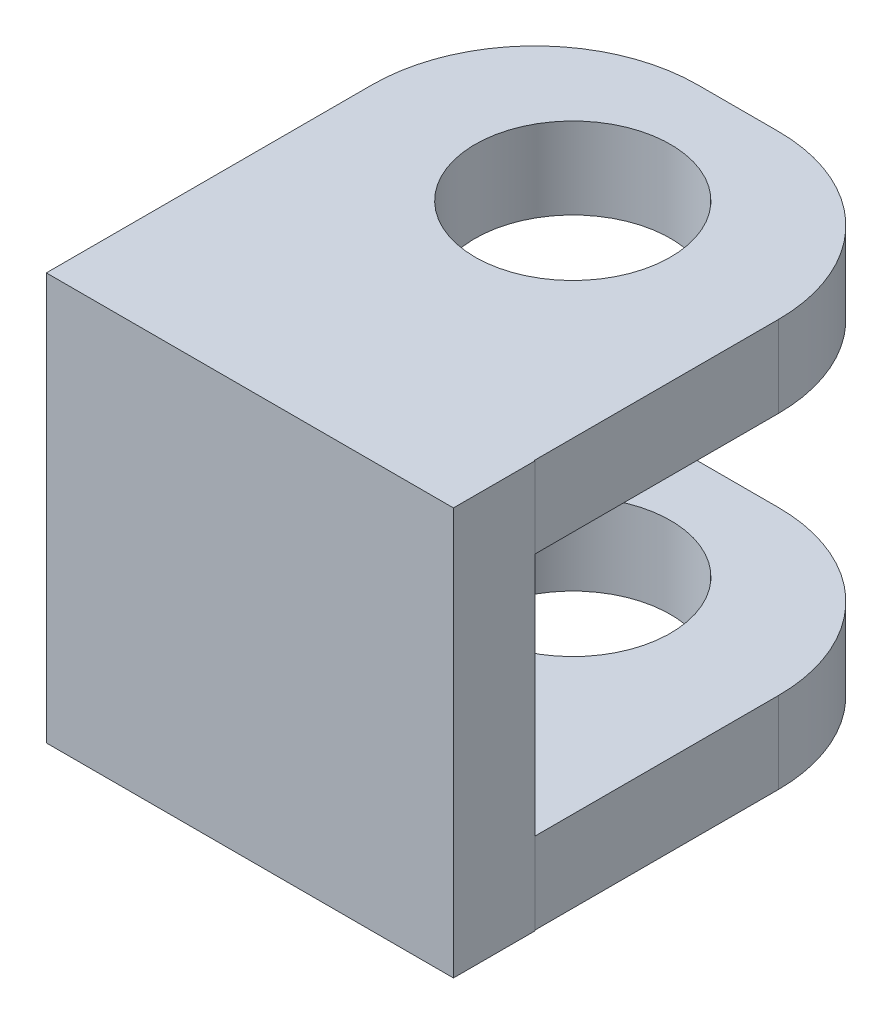
ISO-10303-21;
HEADER;
FILE_DESCRIPTION(('STEP AP214'),'2;1');
FILE_NAME('part.step','',(''),(''),'','','');
FILE_SCHEMA(('AUTOMOTIVE_DESIGN { 1 0 10303 214 1 1 1 1 }'));
ENDSEC;
DATA;
#1=APPLICATION_CONTEXT('core data for automotive mechanical design processes');
#2=APPLICATION_PROTOCOL_DEFINITION('international standard','automotive_design',2000,#1);
#3=PRODUCT_CONTEXT('',#1,'mechanical');
#4=PRODUCT('Part','Part','',(#3));
#5=PRODUCT_RELATED_PRODUCT_CATEGORY('part','',(#4));
#6=PRODUCT_DEFINITION_FORMATION('','',#4);
#7=PRODUCT_DEFINITION_CONTEXT('part definition',#1,'design');
#8=PRODUCT_DEFINITION('design','',#6,#7);
#9=PRODUCT_DEFINITION_SHAPE('','',#8);
#10=(LENGTH_UNIT() NAMED_UNIT(*) SI_UNIT(.MILLI.,.METRE.));
#11=(NAMED_UNIT(*) PLANE_ANGLE_UNIT() SI_UNIT($,.RADIAN.));
#12=(NAMED_UNIT(*) SI_UNIT($,.STERADIAN.) SOLID_ANGLE_UNIT());
#13=UNCERTAINTY_MEASURE_WITH_UNIT(LENGTH_MEASURE(1.E-05),#10,'distance_accuracy_value','');
#14=(GEOMETRIC_REPRESENTATION_CONTEXT(3) GLOBAL_UNCERTAINTY_ASSIGNED_CONTEXT((#13)) GLOBAL_UNIT_ASSIGNED_CONTEXT((#10,
#11,#12)) REPRESENTATION_CONTEXT('',''));
#15=CARTESIAN_POINT('',(0.,0.,0.));
#16=DIRECTION('',(0.,0.,1.));
#17=DIRECTION('',(1.,0.,0.));
#18=AXIS2_PLACEMENT_3D('',#15,#16,#17);
#19=CARTESIAN_POINT('',(0.,0.,10.));
#20=DIRECTION('',(1.,0.,0.));
#21=DIRECTION('',(0.,0.,-1.));
#22=AXIS2_PLACEMENT_3D('',#19,#20,#21);
#23=PLANE('',#22);
#24=DIRECTION('',(0.,0.,-1.));
#25=VECTOR('',#24,1.);
#26=CARTESIAN_POINT('',(0.,50.,10.));
#27=LINE('',#26,#25);
#28=CARTESIAN_POINT('',(0.,50.,10.));
#29=VERTEX_POINT('',#28);
#30=CARTESIAN_POINT('',(0.,50.,-29.9999999999999));
#31=VERTEX_POINT('',#30);
#32=EDGE_CURVE('E173',#29,#31,#27,.T.);
#33=ORIENTED_EDGE('',*,*,#32,.T.);
#34=DIRECTION('',(0.,1.,0.));
#35=VECTOR('',#34,1.);
#36=CARTESIAN_POINT('',(0.,40.,-29.9999999999999));
#37=LINE('',#36,#35);
#38=CARTESIAN_POINT('',(0.,40.,-29.9999999999999));
#39=VERTEX_POINT('',#38);
#40=EDGE_CURVE('E151',#39,#31,#37,.T.);
#41=ORIENTED_EDGE('',*,*,#40,.F.);
#42=DIRECTION('',(0.,0.,1.));
#43=VECTOR('',#42,1.);
#44=CARTESIAN_POINT('',(0.,40.,0.));
#45=LINE('',#44,#43);
#46=CARTESIAN_POINT('',(0.,40.,0.));
#47=VERTEX_POINT('',#46);
#48=EDGE_CURVE('E143',#39,#47,#45,.T.);
#49=ORIENTED_EDGE('',*,*,#48,.T.);
#50=DIRECTION('',(0.,-1.,0.));
#51=VECTOR('',#50,1.);
#52=CARTESIAN_POINT('',(0.,0.,0.));
#53=LINE('',#52,#51);
#54=CARTESIAN_POINT('',(0.,10.,0.));
#55=VERTEX_POINT('',#54);
#56=EDGE_CURVE('E60',#47,#55,#53,.T.);
#57=ORIENTED_EDGE('',*,*,#56,.T.);
#58=DIRECTION('',(0.,0.,1.));
#59=VECTOR('',#58,1.);
#60=CARTESIAN_POINT('',(0.,10.,0.));
#61=LINE('',#60,#59);
#62=CARTESIAN_POINT('',(0.,10.,-29.9999999999999));
#63=VERTEX_POINT('',#62);
#64=EDGE_CURVE('E218',#63,#55,#61,.T.);
#65=ORIENTED_EDGE('',*,*,#64,.F.);
#66=DIRECTION('',(0.,-1.,0.));
#67=VECTOR('',#66,1.);
#68=CARTESIAN_POINT('',(0.,10.,-29.9999999999999));
#69=LINE('',#68,#67);
#70=CARTESIAN_POINT('',(0.,0.,-29.9999999999999));
#71=VERTEX_POINT('',#70);
#72=EDGE_CURVE('E211',#63,#71,#69,.T.);
#73=ORIENTED_EDGE('',*,*,#72,.T.);
#74=DIRECTION('',(0.,0.,-1.));
#75=VECTOR('',#74,1.);
#76=CARTESIAN_POINT('',(0.,0.,10.));
#77=LINE('',#76,#75);
#78=CARTESIAN_POINT('',(0.,0.,10.));
#79=VERTEX_POINT('',#78);
#80=EDGE_CURVE('E11',#79,#71,#77,.T.);
#81=ORIENTED_EDGE('',*,*,#80,.F.);
#82=DIRECTION('',(0.,-1.,0.));
#83=VECTOR('',#82,1.);
#84=CARTESIAN_POINT('',(0.,0.,10.));
#85=LINE('',#84,#83);
#86=EDGE_CURVE('E172',#29,#79,#85,.T.);
#87=ORIENTED_EDGE('',*,*,#86,.F.);
#88=EDGE_LOOP('',(#33,#41,#49,#57,#65,#73,#81,#87));
#89=FACE_BOUND('',#88,.T.);
#90=ADVANCED_FACE('F37',(#89),#23,.F.);
#91=CARTESIAN_POINT('',(0.,0.,10.));
#92=DIRECTION('',(0.,1.,0.));
#93=DIRECTION('',(0.,0.,1.));
#94=AXIS2_PLACEMENT_3D('',#91,#92,#93);
#95=PLANE('',#94);
#96=CARTESIAN_POINT('',(24.6590423705941,0.,-29.9999999999999));
#97=DIRECTION('',(0.,1.,0.));
#98=DIRECTION('',(0.,0.,1.));
#99=AXIS2_PLACEMENT_3D('',#96,#97,#98);
#100=CIRCLE('',#99,12.);
#101=CARTESIAN_POINT('',(24.6590423705941,0.,-17.9999999999999));
#102=VERTEX_POINT('',#101);
#103=EDGE_CURVE('E250',#102,#102,#100,.T.);
#104=ORIENTED_EDGE('',*,*,#103,.T.);
#105=EDGE_LOOP('',(#104));
#106=FACE_BOUND('',#105,.T.);
#107=ORIENTED_EDGE('',*,*,#80,.T.);
#108=CARTESIAN_POINT('',(20.,0.,-30.));
#109=DIRECTION('',(0.,1.,0.));
#110=DIRECTION('',(0.,0.,1.));
#111=AXIS2_PLACEMENT_3D('',#108,#109,#110);
#112=CIRCLE('',#111,20.);
#113=CARTESIAN_POINT('',(20.0000000000001,0.,-50.));
#114=VERTEX_POINT('',#113);
#115=EDGE_CURVE('E215',#114,#71,#112,.T.);
#116=ORIENTED_EDGE('',*,*,#115,.F.);
#117=DIRECTION('',(-1.,0.,0.));
#118=VECTOR('',#117,1.);
#119=CARTESIAN_POINT('',(20.0000000000001,0.,-50.));
#120=LINE('',#119,#118);
#121=CARTESIAN_POINT('',(29.9110021678277,0.,-50.));
#122=VERTEX_POINT('',#121);
#123=EDGE_CURVE('E219',#122,#114,#120,.T.);
#124=ORIENTED_EDGE('',*,*,#123,.F.);
#125=CARTESIAN_POINT('',(29.9110021678279,0.,-30.));
#126=DIRECTION('',(0.,1.,0.));
#127=DIRECTION('',(0.,0.,-1.));
#128=AXIS2_PLACEMENT_3D('',#125,#126,#127);
#129=CIRCLE('',#128,20.);
#130=CARTESIAN_POINT('',(49.9110021678279,0.,-29.9999999999999));
#131=VERTEX_POINT('',#130);
#132=EDGE_CURVE('E221',#131,#122,#129,.T.);
#133=ORIENTED_EDGE('',*,*,#132,.F.);
#134=DIRECTION('',(0.,0.,-1.));
#135=VECTOR('',#134,1.);
#136=CARTESIAN_POINT('',(49.9110021678279,0.,0.));
#137=LINE('',#136,#135);
#138=CARTESIAN_POINT('',(49.9110021678279,0.,0.));
#139=VERTEX_POINT('',#138);
#140=EDGE_CURVE('E223',#139,#131,#137,.T.);
#141=ORIENTED_EDGE('',*,*,#140,.F.);
#142=DIRECTION('',(1.,0.,0.));
#143=VECTOR('',#142,1.);
#144=CARTESIAN_POINT('',(0.,0.,0.));
#145=LINE('',#144,#143);
#146=CARTESIAN_POINT('',(50.,0.,0.));
#147=VERTEX_POINT('',#146);
#148=EDGE_CURVE('E52',#139,#147,#145,.T.);
#149=ORIENTED_EDGE('',*,*,#148,.T.);
#150=DIRECTION('',(0.,0.,-1.));
#151=VECTOR('',#150,1.);
#152=CARTESIAN_POINT('',(50.,0.,10.));
#153=LINE('',#152,#151);
#154=CARTESIAN_POINT('',(50.,0.,10.));
#155=VERTEX_POINT('',#154);
#156=EDGE_CURVE('E45',#155,#147,#153,.T.);
#157=ORIENTED_EDGE('',*,*,#156,.F.);
#158=DIRECTION('',(1.,0.,0.));
#159=VECTOR('',#158,1.);
#160=CARTESIAN_POINT('',(0.,0.,10.));
#161=LINE('',#160,#159);
#162=EDGE_CURVE('E199',#79,#155,#161,.T.);
#163=ORIENTED_EDGE('',*,*,#162,.F.);
#164=EDGE_LOOP('',(#107,#116,#124,#133,#141,#149,#157,#163));
#165=FACE_BOUND('',#164,.T.);
#166=ADVANCED_FACE('F284',(#106,#165),#95,.F.);
#167=CARTESIAN_POINT('',(50.,0.,10.));
#168=DIRECTION('',(-1.,0.,0.));
#169=DIRECTION('',(0.,-1.,0.));
#170=AXIS2_PLACEMENT_3D('',#167,#168,#169);
#171=PLANE('',#170);
#172=DIRECTION('',(0.,1.,0.));
#173=VECTOR('',#172,1.);
#174=CARTESIAN_POINT('',(50.,0.,0.));
#175=LINE('',#174,#173);
#176=CARTESIAN_POINT('',(50.,50.,0.));
#177=VERTEX_POINT('',#176);
#178=EDGE_CURVE('E160',#147,#177,#175,.T.);
#179=ORIENTED_EDGE('',*,*,#178,.T.);
#180=DIRECTION('',(0.,0.,-1.));
#181=VECTOR('',#180,1.);
#182=CARTESIAN_POINT('',(50.,50.,10.));
#183=LINE('',#182,#181);
#184=CARTESIAN_POINT('',(50.,50.,10.));
#185=VERTEX_POINT('',#184);
#186=EDGE_CURVE('E175',#185,#177,#183,.T.);
#187=ORIENTED_EDGE('',*,*,#186,.F.);
#188=DIRECTION('',(0.,1.,0.));
#189=VECTOR('',#188,1.);
#190=CARTESIAN_POINT('',(50.,0.,10.));
#191=LINE('',#190,#189);
#192=EDGE_CURVE('E184',#155,#185,#191,.T.);
#193=ORIENTED_EDGE('',*,*,#192,.F.);
#194=ORIENTED_EDGE('',*,*,#156,.T.);
#195=EDGE_LOOP('',(#179,#187,#193,#194));
#196=FACE_BOUND('',#195,.T.);
#197=ADVANCED_FACE('F182',(#196),#171,.F.);
#198=CARTESIAN_POINT('',(0.,50.,10.));
#199=DIRECTION('',(0.,-1.,0.));
#200=DIRECTION('',(0.,0.,-1.));
#201=AXIS2_PLACEMENT_3D('',#198,#199,#200);
#202=PLANE('',#201);
#203=CARTESIAN_POINT('',(24.6590423705941,50.,-29.9999999999999));
#204=DIRECTION('',(0.,1.,0.));
#205=DIRECTION('',(0.,0.,1.));
#206=AXIS2_PLACEMENT_3D('',#203,#204,#205);
#207=CIRCLE('',#206,12.);
#208=CARTESIAN_POINT('',(24.6590423705941,50.,-17.9999999999999));
#209=VERTEX_POINT('',#208);
#210=EDGE_CURVE('E264',#209,#209,#207,.T.);
#211=ORIENTED_EDGE('',*,*,#210,.F.);
#212=EDGE_LOOP('',(#211));
#213=FACE_BOUND('',#212,.T.);
#214=DIRECTION('',(-1.,0.,0.));
#215=VECTOR('',#214,1.);
#216=CARTESIAN_POINT('',(0.,50.,0.));
#217=LINE('',#216,#215);
#218=CARTESIAN_POINT('',(49.9110021678279,50.,0.));
#219=VERTEX_POINT('',#218);
#220=EDGE_CURVE('E169',#177,#219,#217,.T.);
#221=ORIENTED_EDGE('',*,*,#220,.T.);
#222=DIRECTION('',(0.,0.,-1.));
#223=VECTOR('',#222,1.);
#224=CARTESIAN_POINT('',(49.9110021678279,50.,0.));
#225=LINE('',#224,#223);
#226=CARTESIAN_POINT('',(49.9110021678279,50.,-29.9999999999999));
#227=VERTEX_POINT('',#226);
#228=EDGE_CURVE('E192',#219,#227,#225,.T.);
#229=ORIENTED_EDGE('',*,*,#228,.T.);
#230=CARTESIAN_POINT('',(29.9110021678279,50.,-30.));
#231=DIRECTION('',(0.,1.,0.));
#232=DIRECTION('',(0.,0.,1.));
#233=AXIS2_PLACEMENT_3D('',#230,#231,#232);
#234=CIRCLE('',#233,20.);
#235=CARTESIAN_POINT('',(29.9110021678277,50.,-50.));
#236=VERTEX_POINT('',#235);
#237=EDGE_CURVE('E247',#227,#236,#234,.T.);
#238=ORIENTED_EDGE('',*,*,#237,.T.);
#239=DIRECTION('',(-1.,0.,0.));
#240=VECTOR('',#239,1.);
#241=CARTESIAN_POINT('',(20.0000000000001,50.,-50.));
#242=LINE('',#241,#240);
#243=CARTESIAN_POINT('',(20.0000000000001,50.,-50.));
#244=VERTEX_POINT('',#243);
#245=EDGE_CURVE('E244',#236,#244,#242,.T.);
#246=ORIENTED_EDGE('',*,*,#245,.T.);
#247=CARTESIAN_POINT('',(20.,50.,-30.));
#248=DIRECTION('',(0.,1.,0.));
#249=DIRECTION('',(0.,0.,1.));
#250=AXIS2_PLACEMENT_3D('',#247,#248,#249);
#251=CIRCLE('',#250,20.);
#252=EDGE_CURVE('E152',#244,#31,#251,.T.);
#253=ORIENTED_EDGE('',*,*,#252,.T.);
#254=ORIENTED_EDGE('',*,*,#32,.F.);
#255=DIRECTION('',(-1.,0.,0.));
#256=VECTOR('',#255,1.);
#257=CARTESIAN_POINT('',(0.,50.,10.));
#258=LINE('',#257,#256);
#259=EDGE_CURVE('E165',#185,#29,#258,.T.);
#260=ORIENTED_EDGE('',*,*,#259,.F.);
#261=ORIENTED_EDGE('',*,*,#186,.T.);
#262=EDGE_LOOP('',(#221,#229,#238,#246,#253,#254,#260,#261));
#263=FACE_BOUND('',#262,.T.);
#264=ADVANCED_FACE('F190',(#213,#263),#202,.F.);
#265=CARTESIAN_POINT('',(0.,0.,10.));
#266=DIRECTION('',(0.,0.,-1.));
#267=DIRECTION('',(-1.,0.,0.));
#268=AXIS2_PLACEMENT_3D('',#265,#266,#267);
#269=PLANE('',#268);
#270=ORIENTED_EDGE('',*,*,#86,.T.);
#271=ORIENTED_EDGE('',*,*,#162,.T.);
#272=ORIENTED_EDGE('',*,*,#192,.T.);
#273=ORIENTED_EDGE('',*,*,#259,.T.);
#274=EDGE_LOOP('',(#270,#271,#272,#273));
#275=FACE_BOUND('',#274,.T.);
#276=ADVANCED_FACE('F296',(#275),#269,.F.);
#277=CARTESIAN_POINT('',(0.,0.,0.));
#278=DIRECTION('',(0.,0.,-1.));
#279=DIRECTION('',(-1.,0.,0.));
#280=AXIS2_PLACEMENT_3D('',#277,#278,#279);
#281=PLANE('',#280);
#282=DIRECTION('',(0.,1.,0.));
#283=VECTOR('',#282,1.);
#284=CARTESIAN_POINT('',(49.9110021678279,40.,0.));
#285=LINE('',#284,#283);
#286=CARTESIAN_POINT('',(49.9110021678279,40.,0.));
#287=VERTEX_POINT('',#286);
#288=EDGE_CURVE('E187',#287,#219,#285,.T.);
#289=ORIENTED_EDGE('',*,*,#288,.T.);
#290=ORIENTED_EDGE('',*,*,#220,.F.);
#291=ORIENTED_EDGE('',*,*,#178,.F.);
#292=ORIENTED_EDGE('',*,*,#148,.F.);
#293=DIRECTION('',(0.,-1.,0.));
#294=VECTOR('',#293,1.);
#295=CARTESIAN_POINT('',(49.9110021678279,10.,0.));
#296=LINE('',#295,#294);
#297=CARTESIAN_POINT('',(49.9110021678279,10.,0.));
#298=VERTEX_POINT('',#297);
#299=EDGE_CURVE('E158',#298,#139,#296,.T.);
#300=ORIENTED_EDGE('',*,*,#299,.F.);
#301=DIRECTION('',(1.,0.,0.));
#302=VECTOR('',#301,1.);
#303=CARTESIAN_POINT('',(0.,10.,0.));
#304=LINE('',#303,#302);
#305=EDGE_CURVE('E156',#55,#298,#304,.T.);
#306=ORIENTED_EDGE('',*,*,#305,.F.);
#307=ORIENTED_EDGE('',*,*,#56,.F.);
#308=DIRECTION('',(1.,0.,0.));
#309=VECTOR('',#308,1.);
#310=CARTESIAN_POINT('',(0.,40.,0.));
#311=LINE('',#310,#309);
#312=EDGE_CURVE('E140',#47,#287,#311,.T.);
#313=ORIENTED_EDGE('',*,*,#312,.T.);
#314=EDGE_LOOP('',(#289,#290,#291,#292,#300,#306,#307,#313));
#315=FACE_BOUND('',#314,.T.);
#316=ADVANCED_FACE('F154',(#315),#281,.T.);
#317=CARTESIAN_POINT('',(49.9110021678279,10.,0.));
#318=DIRECTION('',(-1.,0.,0.));
#319=DIRECTION('',(0.,0.,1.));
#320=AXIS2_PLACEMENT_3D('',#317,#318,#319);
#321=PLANE('',#320);
#322=ORIENTED_EDGE('',*,*,#140,.T.);
#323=DIRECTION('',(0.,-1.,0.));
#324=VECTOR('',#323,1.);
#325=CARTESIAN_POINT('',(49.9110021678279,10.,-29.9999999999999));
#326=LINE('',#325,#324);
#327=CARTESIAN_POINT('',(49.9110021678279,10.,-29.9999999999999));
#328=VERTEX_POINT('',#327);
#329=EDGE_CURVE('E162',#328,#131,#326,.T.);
#330=ORIENTED_EDGE('',*,*,#329,.F.);
#331=DIRECTION('',(0.,0.,-1.));
#332=VECTOR('',#331,1.);
#333=CARTESIAN_POINT('',(49.9110021678279,10.,0.));
#334=LINE('',#333,#332);
#335=EDGE_CURVE('E230',#298,#328,#334,.T.);
#336=ORIENTED_EDGE('',*,*,#335,.F.);
#337=ORIENTED_EDGE('',*,*,#299,.T.);
#338=EDGE_LOOP('',(#322,#330,#336,#337));
#339=FACE_BOUND('',#338,.T.);
#340=ADVANCED_FACE('F300',(#339),#321,.F.);
#341=CARTESIAN_POINT('',(29.9110021678279,10.,-30.));
#342=DIRECTION('',(0.,-1.,0.));
#343=DIRECTION('',(0.,0.,-1.));
#344=AXIS2_PLACEMENT_3D('',#341,#342,#343);
#345=CYLINDRICAL_SURFACE('',#344,20.);
#346=ORIENTED_EDGE('',*,*,#132,.T.);
#347=DIRECTION('',(0.,-1.,0.));
#348=VECTOR('',#347,1.);
#349=CARTESIAN_POINT('',(29.9110021678277,10.,-50.));
#350=LINE('',#349,#348);
#351=CARTESIAN_POINT('',(29.9110021678277,10.,-50.));
#352=VERTEX_POINT('',#351);
#353=EDGE_CURVE('E205',#352,#122,#350,.T.);
#354=ORIENTED_EDGE('',*,*,#353,.F.);
#355=CARTESIAN_POINT('',(29.9110021678279,10.,-30.));
#356=DIRECTION('',(0.,1.,0.));
#357=DIRECTION('',(0.,0.,-1.));
#358=AXIS2_PLACEMENT_3D('',#355,#356,#357);
#359=CIRCLE('',#358,20.);
#360=EDGE_CURVE('E228',#328,#352,#359,.T.);
#361=ORIENTED_EDGE('',*,*,#360,.F.);
#362=ORIENTED_EDGE('',*,*,#329,.T.);
#363=EDGE_LOOP('',(#346,#354,#361,#362));
#364=FACE_BOUND('',#363,.T.);
#365=ADVANCED_FACE('F305',(#364),#345,.T.);
#366=CARTESIAN_POINT('',(20.0000000000001,10.,-50.));
#367=DIRECTION('',(0.,0.,1.));
#368=DIRECTION('',(1.,0.,0.));
#369=AXIS2_PLACEMENT_3D('',#366,#367,#368);
#370=PLANE('',#369);
#371=ORIENTED_EDGE('',*,*,#123,.T.);
#372=DIRECTION('',(0.,-1.,0.));
#373=VECTOR('',#372,1.);
#374=CARTESIAN_POINT('',(20.0000000000001,10.,-50.));
#375=LINE('',#374,#373);
#376=CARTESIAN_POINT('',(20.0000000000001,10.,-50.));
#377=VERTEX_POINT('',#376);
#378=EDGE_CURVE('E208',#377,#114,#375,.T.);
#379=ORIENTED_EDGE('',*,*,#378,.F.);
#380=DIRECTION('',(-1.,0.,0.));
#381=VECTOR('',#380,1.);
#382=CARTESIAN_POINT('',(20.0000000000001,10.,-50.));
#383=LINE('',#382,#381);
#384=EDGE_CURVE('E226',#352,#377,#383,.T.);
#385=ORIENTED_EDGE('',*,*,#384,.F.);
#386=ORIENTED_EDGE('',*,*,#353,.T.);
#387=EDGE_LOOP('',(#371,#379,#385,#386));
#388=FACE_BOUND('',#387,.T.);
#389=ADVANCED_FACE('F309',(#388),#370,.F.);
#390=CARTESIAN_POINT('',(20.,10.,-30.));
#391=DIRECTION('',(0.,-1.,0.));
#392=DIRECTION('',(0.,0.,-1.));
#393=AXIS2_PLACEMENT_3D('',#390,#391,#392);
#394=CYLINDRICAL_SURFACE('',#393,20.);
#395=ORIENTED_EDGE('',*,*,#115,.T.);
#396=ORIENTED_EDGE('',*,*,#72,.F.);
#397=CARTESIAN_POINT('',(20.,10.,-30.));
#398=DIRECTION('',(0.,1.,0.));
#399=DIRECTION('',(0.,0.,1.));
#400=AXIS2_PLACEMENT_3D('',#397,#398,#399);
#401=CIRCLE('',#400,20.);
#402=EDGE_CURVE('E214',#377,#63,#401,.T.);
#403=ORIENTED_EDGE('',*,*,#402,.F.);
#404=ORIENTED_EDGE('',*,*,#378,.T.);
#405=EDGE_LOOP('',(#395,#396,#403,#404));
#406=FACE_BOUND('',#405,.T.);
#407=ADVANCED_FACE('F313',(#406),#394,.T.);
#408=CARTESIAN_POINT('',(20.,10.,-30.));
#409=DIRECTION('',(0.,1.,0.));
#410=DIRECTION('',(0.,0.,1.));
#411=AXIS2_PLACEMENT_3D('',#408,#409,#410);
#412=PLANE('',#411);
#413=CARTESIAN_POINT('',(24.6590423705941,9.99999999999999,-29.9999999999999));
#414=DIRECTION('',(0.,1.,0.));
#415=DIRECTION('',(0.,0.,1.));
#416=AXIS2_PLACEMENT_3D('',#413,#414,#415);
#417=CIRCLE('',#416,12.);
#418=CARTESIAN_POINT('',(24.6590423705941,9.99999999999999,-17.9999999999999));
#419=VERTEX_POINT('',#418);
#420=EDGE_CURVE('E261',#419,#419,#417,.T.);
#421=ORIENTED_EDGE('',*,*,#420,.F.);
#422=EDGE_LOOP('',(#421));
#423=FACE_BOUND('',#422,.T.);
#424=ORIENTED_EDGE('',*,*,#64,.T.);
#425=ORIENTED_EDGE('',*,*,#305,.T.);
#426=ORIENTED_EDGE('',*,*,#335,.T.);
#427=ORIENTED_EDGE('',*,*,#360,.T.);
#428=ORIENTED_EDGE('',*,*,#384,.T.);
#429=ORIENTED_EDGE('',*,*,#402,.T.);
#430=EDGE_LOOP('',(#424,#425,#426,#427,#428,#429));
#431=FACE_BOUND('',#430,.T.);
#432=ADVANCED_FACE('F317',(#423,#431),#412,.T.);
#433=CARTESIAN_POINT('',(20.,40.,-30.));
#434=DIRECTION('',(0.,1.,0.));
#435=DIRECTION('',(0.,0.,1.));
#436=AXIS2_PLACEMENT_3D('',#433,#434,#435);
#437=CYLINDRICAL_SURFACE('',#436,20.);
#438=ORIENTED_EDGE('',*,*,#252,.F.);
#439=DIRECTION('',(0.,1.,0.));
#440=VECTOR('',#439,1.);
#441=CARTESIAN_POINT('',(20.0000000000001,40.,-50.));
#442=LINE('',#441,#440);
#443=CARTESIAN_POINT('',(20.0000000000001,40.,-50.));
#444=VERTEX_POINT('',#443);
#445=EDGE_CURVE('E240',#444,#244,#442,.T.);
#446=ORIENTED_EDGE('',*,*,#445,.F.);
#447=CARTESIAN_POINT('',(20.,40.,-30.));
#448=DIRECTION('',(0.,1.,0.));
#449=DIRECTION('',(0.,0.,1.));
#450=AXIS2_PLACEMENT_3D('',#447,#448,#449);
#451=CIRCLE('',#450,20.);
#452=EDGE_CURVE('E236',#444,#39,#451,.T.);
#453=ORIENTED_EDGE('',*,*,#452,.T.);
#454=ORIENTED_EDGE('',*,*,#40,.T.);
#455=EDGE_LOOP('',(#438,#446,#453,#454));
#456=FACE_BOUND('',#455,.T.);
#457=ADVANCED_FACE('F321',(#456),#437,.T.);
#458=CARTESIAN_POINT('',(20.0000000000001,40.,-50.));
#459=DIRECTION('',(0.,0.,-1.));
#460=DIRECTION('',(-1.,0.,0.));
#461=AXIS2_PLACEMENT_3D('',#458,#459,#460);
#462=PLANE('',#461);
#463=ORIENTED_EDGE('',*,*,#245,.F.);
#464=DIRECTION('',(0.,1.,0.));
#465=VECTOR('',#464,1.);
#466=CARTESIAN_POINT('',(29.9110021678277,40.,-50.));
#467=LINE('',#466,#465);
#468=CARTESIAN_POINT('',(29.9110021678277,40.,-50.));
#469=VERTEX_POINT('',#468);
#470=EDGE_CURVE('E238',#469,#236,#467,.T.);
#471=ORIENTED_EDGE('',*,*,#470,.F.);
#472=DIRECTION('',(-1.,0.,0.));
#473=VECTOR('',#472,1.);
#474=CARTESIAN_POINT('',(20.0000000000001,40.,-50.));
#475=LINE('',#474,#473);
#476=EDGE_CURVE('E252',#469,#444,#475,.T.);
#477=ORIENTED_EDGE('',*,*,#476,.T.);
#478=ORIENTED_EDGE('',*,*,#445,.T.);
#479=EDGE_LOOP('',(#463,#471,#477,#478));
#480=FACE_BOUND('',#479,.T.);
#481=ADVANCED_FACE('F329',(#480),#462,.T.);
#482=CARTESIAN_POINT('',(29.9110021678279,40.,-30.));
#483=DIRECTION('',(0.,1.,0.));
#484=DIRECTION('',(0.,0.,1.));
#485=AXIS2_PLACEMENT_3D('',#482,#483,#484);
#486=CYLINDRICAL_SURFACE('',#485,20.);
#487=ORIENTED_EDGE('',*,*,#237,.F.);
#488=DIRECTION('',(0.,1.,0.));
#489=VECTOR('',#488,1.);
#490=CARTESIAN_POINT('',(49.9110021678279,40.,-29.9999999999999));
#491=LINE('',#490,#489);
#492=CARTESIAN_POINT('',(49.9110021678279,40.,-29.9999999999999));
#493=VERTEX_POINT('',#492);
#494=EDGE_CURVE('E235',#493,#227,#491,.T.);
#495=ORIENTED_EDGE('',*,*,#494,.F.);
#496=CARTESIAN_POINT('',(29.9110021678279,40.,-30.));
#497=DIRECTION('',(0.,1.,0.));
#498=DIRECTION('',(0.,0.,1.));
#499=AXIS2_PLACEMENT_3D('',#496,#497,#498);
#500=CIRCLE('',#499,20.);
#501=EDGE_CURVE('E255',#493,#469,#500,.T.);
#502=ORIENTED_EDGE('',*,*,#501,.T.);
#503=ORIENTED_EDGE('',*,*,#470,.T.);
#504=EDGE_LOOP('',(#487,#495,#502,#503));
#505=FACE_BOUND('',#504,.T.);
#506=ADVANCED_FACE('F325',(#505),#486,.T.);
#507=CARTESIAN_POINT('',(49.9110021678279,40.,0.));
#508=DIRECTION('',(1.,0.,0.));
#509=DIRECTION('',(0.,0.,-1.));
#510=AXIS2_PLACEMENT_3D('',#507,#508,#509);
#511=PLANE('',#510);
#512=ORIENTED_EDGE('',*,*,#228,.F.);
#513=ORIENTED_EDGE('',*,*,#288,.F.);
#514=DIRECTION('',(0.,0.,-1.));
#515=VECTOR('',#514,1.);
#516=CARTESIAN_POINT('',(49.9110021678279,40.,0.));
#517=LINE('',#516,#515);
#518=EDGE_CURVE('E147',#287,#493,#517,.T.);
#519=ORIENTED_EDGE('',*,*,#518,.T.);
#520=ORIENTED_EDGE('',*,*,#494,.T.);
#521=EDGE_LOOP('',(#512,#513,#519,#520));
#522=FACE_BOUND('',#521,.T.);
#523=ADVANCED_FACE('F281',(#522),#511,.T.);
#524=CARTESIAN_POINT('',(20.,40.,-30.));
#525=DIRECTION('',(0.,1.,0.));
#526=DIRECTION('',(0.,0.,1.));
#527=AXIS2_PLACEMENT_3D('',#524,#525,#526);
#528=PLANE('',#527);
#529=CARTESIAN_POINT('',(24.6590423705941,40.,-29.9999999999999));
#530=DIRECTION('',(0.,1.,0.));
#531=DIRECTION('',(0.,0.,1.));
#532=AXIS2_PLACEMENT_3D('',#529,#530,#531);
#533=CIRCLE('',#532,12.);
#534=CARTESIAN_POINT('',(24.6590423705941,40.,-17.9999999999999));
#535=VERTEX_POINT('',#534);
#536=EDGE_CURVE('E40',#535,#535,#533,.T.);
#537=ORIENTED_EDGE('',*,*,#536,.T.);
#538=EDGE_LOOP('',(#537));
#539=FACE_BOUND('',#538,.T.);
#540=ORIENTED_EDGE('',*,*,#48,.F.);
#541=ORIENTED_EDGE('',*,*,#452,.F.);
#542=ORIENTED_EDGE('',*,*,#476,.F.);
#543=ORIENTED_EDGE('',*,*,#501,.F.);
#544=ORIENTED_EDGE('',*,*,#518,.F.);
#545=ORIENTED_EDGE('',*,*,#312,.F.);
#546=EDGE_LOOP('',(#540,#541,#542,#543,#544,#545));
#547=FACE_BOUND('',#546,.T.);
#548=ADVANCED_FACE('F141',(#539,#547),#528,.F.);
#549=CARTESIAN_POINT('',(24.6590423705941,-70.,-29.9999999999999));
#550=DIRECTION('',(0.,1.,0.));
#551=DIRECTION('',(0.,0.,1.));
#552=AXIS2_PLACEMENT_3D('',#549,#550,#551);
#553=CYLINDRICAL_SURFACE('',#552,12.);
#554=CARTESIAN_POINT('',(24.6590423705941,50.,-17.9999999999999));
#555=CARTESIAN_POINT('',(24.6590423705941,49.8958333333333,-17.9999999999999));
#556=CARTESIAN_POINT('',(24.6590423705941,49.7916666666667,-17.9999999999999));
#557=CARTESIAN_POINT('',(24.6590423705941,49.5833333333333,-17.9999999999999));
#558=CARTESIAN_POINT('',(24.6590423705941,49.4791666666667,-17.9999999999999));
#559=CARTESIAN_POINT('',(24.6590423705941,49.2708333333333,-17.9999999999999));
#560=CARTESIAN_POINT('',(24.6590423705941,49.1666666666667,-17.9999999999999));
#561=CARTESIAN_POINT('',(24.6590423705941,48.9583333333333,-17.9999999999999));
#562=CARTESIAN_POINT('',(24.6590423705941,48.8541666666667,-17.9999999999999));
#563=CARTESIAN_POINT('',(24.6590423705941,48.6458333333333,-17.9999999999999));
#564=CARTESIAN_POINT('',(24.6590423705941,48.5416666666667,-17.9999999999999));
#565=CARTESIAN_POINT('',(24.6590423705941,48.3333333333333,-17.9999999999999));
#566=CARTESIAN_POINT('',(24.6590423705941,48.2291666666667,-17.9999999999999));
#567=CARTESIAN_POINT('',(24.6590423705941,48.0208333333333,-17.9999999999999));
#568=CARTESIAN_POINT('',(24.6590423705941,47.9166666666667,-17.9999999999999));
#569=CARTESIAN_POINT('',(24.6590423705941,47.7083333333333,-17.9999999999999));
#570=CARTESIAN_POINT('',(24.6590423705941,47.6041666666667,-17.9999999999999));
#571=CARTESIAN_POINT('',(24.6590423705941,47.3958333333333,-17.9999999999999));
#572=CARTESIAN_POINT('',(24.6590423705941,47.2916666666667,-17.9999999999999));
#573=CARTESIAN_POINT('',(24.6590423705941,47.0833333333333,-17.9999999999999));
#574=CARTESIAN_POINT('',(24.6590423705941,46.9791666666667,-17.9999999999999));
#575=CARTESIAN_POINT('',(24.6590423705941,46.7708333333333,-17.9999999999999));
#576=CARTESIAN_POINT('',(24.6590423705941,46.6666666666667,-17.9999999999999));
#577=CARTESIAN_POINT('',(24.6590423705941,46.4583333333333,-17.9999999999999));
#578=CARTESIAN_POINT('',(24.6590423705941,46.3541666666667,-17.9999999999999));
#579=CARTESIAN_POINT('',(24.6590423705941,46.1458333333333,-17.9999999999999));
#580=CARTESIAN_POINT('',(24.6590423705941,46.0416666666667,-17.9999999999999));
#581=CARTESIAN_POINT('',(24.6590423705941,45.8333333333333,-17.9999999999999));
#582=CARTESIAN_POINT('',(24.6590423705941,45.7291666666667,-17.9999999999999));
#583=CARTESIAN_POINT('',(24.6590423705941,45.5208333333333,-17.9999999999999));
#584=CARTESIAN_POINT('',(24.6590423705941,45.4166666666667,-17.9999999999999));
#585=CARTESIAN_POINT('',(24.6590423705941,45.2083333333333,-17.9999999999999));
#586=CARTESIAN_POINT('',(24.6590423705941,45.1041666666667,-17.9999999999999));
#587=CARTESIAN_POINT('',(24.6590423705941,44.8958333333333,-17.9999999999999));
#588=CARTESIAN_POINT('',(24.6590423705941,44.7916666666667,-17.9999999999999));
#589=CARTESIAN_POINT('',(24.6590423705941,44.5833333333333,-17.9999999999999));
#590=CARTESIAN_POINT('',(24.6590423705941,44.4791666666667,-17.9999999999999));
#591=CARTESIAN_POINT('',(24.6590423705941,44.2708333333333,-17.9999999999999));
#592=CARTESIAN_POINT('',(24.6590423705941,44.1666666666667,-17.9999999999999));
#593=CARTESIAN_POINT('',(24.6590423705941,43.9583333333333,-17.9999999999999));
#594=CARTESIAN_POINT('',(24.6590423705941,43.8541666666667,-17.9999999999999));
#595=CARTESIAN_POINT('',(24.6590423705941,43.6458333333333,-17.9999999999999));
#596=CARTESIAN_POINT('',(24.6590423705941,43.5416666666667,-17.9999999999999));
#597=CARTESIAN_POINT('',(24.6590423705941,43.3333333333333,-17.9999999999999));
#598=CARTESIAN_POINT('',(24.6590423705941,43.2291666666667,-17.9999999999999));
#599=CARTESIAN_POINT('',(24.6590423705941,43.0208333333333,-17.9999999999999));
#600=CARTESIAN_POINT('',(24.6590423705941,42.9166666666667,-17.9999999999999));
#601=CARTESIAN_POINT('',(24.6590423705941,42.7083333333333,-17.9999999999999));
#602=CARTESIAN_POINT('',(24.6590423705941,42.6041666666667,-17.9999999999999));
#603=CARTESIAN_POINT('',(24.6590423705941,42.3958333333333,-17.9999999999999));
#604=CARTESIAN_POINT('',(24.6590423705941,42.2916666666667,-17.9999999999999));
#605=CARTESIAN_POINT('',(24.6590423705941,42.0833333333333,-17.9999999999999));
#606=CARTESIAN_POINT('',(24.6590423705941,41.9791666666667,-17.9999999999999));
#607=CARTESIAN_POINT('',(24.6590423705941,41.7708333333333,-17.9999999999999));
#608=CARTESIAN_POINT('',(24.6590423705941,41.6666666666667,-17.9999999999999));
#609=CARTESIAN_POINT('',(24.6590423705941,41.4583333333333,-17.9999999999999));
#610=CARTESIAN_POINT('',(24.6590423705941,41.3541666666667,-17.9999999999999));
#611=CARTESIAN_POINT('',(24.6590423705941,41.1458333333333,-17.9999999999999));
#612=CARTESIAN_POINT('',(24.6590423705941,41.0416666666667,-17.9999999999999));
#613=CARTESIAN_POINT('',(24.6590423705941,40.8333333333333,-17.9999999999999));
#614=CARTESIAN_POINT('',(24.6590423705941,40.7291666666667,-17.9999999999999));
#615=CARTESIAN_POINT('',(24.6590423705941,40.5208333333333,-17.9999999999999));
#616=CARTESIAN_POINT('',(24.6590423705941,40.4166666666667,-17.9999999999999));
#617=CARTESIAN_POINT('',(24.6590423705941,40.2083333333333,-17.9999999999999));
#618=CARTESIAN_POINT('',(24.6590423705941,40.1041666666667,-17.9999999999999));
#619=CARTESIAN_POINT('',(24.6590423705941,40.,-17.9999999999999));
#620=B_SPLINE_CURVE_WITH_KNOTS('',3,(#554,#555,#556,#557,#558,#559,#560,#561,#562,#563,#564,
#565,#566,#567,#568,#569,#570,#571,#572,#573,#574,#575,#576,#577,#578,#579,#580,#581,#582,#583,
#584,#585,#586,#587,#588,#589,#590,#591,#592,#593,#594,#595,#596,#597,#598,#599,#600,#601,#602,
#603,#604,#605,#606,#607,#608,#609,#610,#611,#612,#613,#614,#615,#616,#617,#618,#619),
.UNSPECIFIED.,.F.,.F.,(4,2,2,2,2,2,2,2,2,2,2,2,2,2,2,2,2,2,2,2,2,2,2,2,2,2,2,2,2,2,2,2,4),(0.,
0.312499999999993,0.625000000000001,0.937500000000008,1.25,1.56249999999999,1.875,
2.18750000000001,2.5,2.8125,3.125,3.43750000000001,3.75,4.0625,4.375,4.68750000000001,5.,5.3125,
5.62500000000001,5.93750000000001,6.25000000000001,6.5625,6.87500000000001,7.18750000000001,
7.50000000000001,7.8125,8.12500000000001,8.43750000000001,8.75000000000001,9.0625,
9.37500000000001,9.68750000000002,10.),.UNSPECIFIED.);
#621=EDGE_CURVE('BSEAM272',#209,#535,#620,.T.);
#622=ORIENTED_EDGE('',*,*,#210,.T.);
#623=ORIENTED_EDGE('',*,*,#536,.F.);
#624=ORIENTED_EDGE('',*,*,#621,.T.);
#625=ORIENTED_EDGE('',*,*,#621,.F.);
#626=EDGE_LOOP('',(#622,#624,#623,#625));
#627=FACE_BOUND('',#626,.T.);
#628=ADVANCED_FACE('F272',(#627),#553,.F.);
#629=CARTESIAN_POINT('',(24.6590423705941,9.99999999999999,-17.9999999999999));
#630=CARTESIAN_POINT('',(24.6590423705941,9.89583333333333,-17.9999999999999));
#631=CARTESIAN_POINT('',(24.6590423705941,9.79166666666667,-17.9999999999999));
#632=CARTESIAN_POINT('',(24.6590423705941,9.58333333333333,-17.9999999999999));
#633=CARTESIAN_POINT('',(24.6590423705941,9.47916666666666,-17.9999999999999));
#634=CARTESIAN_POINT('',(24.6590423705941,9.27083333333333,-17.9999999999999));
#635=CARTESIAN_POINT('',(24.6590423705941,9.16666666666666,-17.9999999999999));
#636=CARTESIAN_POINT('',(24.6590423705941,8.95833333333332,-17.9999999999999));
#637=CARTESIAN_POINT('',(24.6590423705941,8.85416666666666,-17.9999999999999));
#638=CARTESIAN_POINT('',(24.6590423705941,8.64583333333333,-17.9999999999999));
#639=CARTESIAN_POINT('',(24.6590423705941,8.54166666666666,-17.9999999999999));
#640=CARTESIAN_POINT('',(24.6590423705941,8.33333333333333,-17.9999999999999));
#641=CARTESIAN_POINT('',(24.6590423705941,8.22916666666666,-17.9999999999999));
#642=CARTESIAN_POINT('',(24.6590423705941,8.02083333333333,-17.9999999999999));
#643=CARTESIAN_POINT('',(24.6590423705941,7.91666666666666,-17.9999999999999));
#644=CARTESIAN_POINT('',(24.6590423705941,7.70833333333332,-17.9999999999999));
#645=CARTESIAN_POINT('',(24.6590423705941,7.60416666666666,-17.9999999999999));
#646=CARTESIAN_POINT('',(24.6590423705941,7.39583333333333,-17.9999999999999));
#647=CARTESIAN_POINT('',(24.6590423705941,7.29166666666666,-17.9999999999999));
#648=CARTESIAN_POINT('',(24.6590423705941,7.08333333333333,-17.9999999999999));
#649=CARTESIAN_POINT('',(24.6590423705941,6.97916666666666,-17.9999999999999));
#650=CARTESIAN_POINT('',(24.6590423705941,6.77083333333332,-17.9999999999999));
#651=CARTESIAN_POINT('',(24.6590423705941,6.66666666666665,-17.9999999999999));
#652=CARTESIAN_POINT('',(24.6590423705941,6.45833333333332,-17.9999999999999));
#653=CARTESIAN_POINT('',(24.6590423705941,6.35416666666666,-17.9999999999999));
#654=CARTESIAN_POINT('',(24.6590423705941,6.14583333333333,-17.9999999999999));
#655=CARTESIAN_POINT('',(24.6590423705941,6.04166666666666,-17.9999999999999));
#656=CARTESIAN_POINT('',(24.6590423705941,5.83333333333333,-17.9999999999999));
#657=CARTESIAN_POINT('',(24.6590423705941,5.72916666666666,-17.9999999999999));
#658=CARTESIAN_POINT('',(24.6590423705941,5.52083333333332,-17.9999999999999));
#659=CARTESIAN_POINT('',(24.6590423705941,5.41666666666665,-17.9999999999999));
#660=CARTESIAN_POINT('',(24.6590423705941,5.20833333333332,-17.9999999999999));
#661=CARTESIAN_POINT('',(24.6590423705941,5.10416666666666,-17.9999999999999));
#662=CARTESIAN_POINT('',(24.6590423705941,4.89583333333333,-17.9999999999999));
#663=CARTESIAN_POINT('',(24.6590423705941,4.79166666666666,-17.9999999999999));
#664=CARTESIAN_POINT('',(24.6590423705941,4.58333333333333,-17.9999999999999));
#665=CARTESIAN_POINT('',(24.6590423705941,4.47916666666666,-17.9999999999999));
#666=CARTESIAN_POINT('',(24.6590423705941,4.27083333333332,-17.9999999999999));
#667=CARTESIAN_POINT('',(24.6590423705941,4.16666666666665,-17.9999999999999));
#668=CARTESIAN_POINT('',(24.6590423705941,3.95833333333332,-17.9999999999999));
#669=CARTESIAN_POINT('',(24.6590423705941,3.85416666666665,-17.9999999999999));
#670=CARTESIAN_POINT('',(24.6590423705941,3.64583333333333,-17.9999999999999));
#671=CARTESIAN_POINT('',(24.6590423705941,3.54166666666666,-17.9999999999999));
#672=CARTESIAN_POINT('',(24.6590423705941,3.33333333333333,-17.9999999999999));
#673=CARTESIAN_POINT('',(24.6590423705941,3.22916666666666,-17.9999999999999));
#674=CARTESIAN_POINT('',(24.6590423705941,3.02083333333332,-17.9999999999999));
#675=CARTESIAN_POINT('',(24.6590423705941,2.91666666666665,-17.9999999999999));
#676=CARTESIAN_POINT('',(24.6590423705941,2.70833333333332,-17.9999999999999));
#677=CARTESIAN_POINT('',(24.6590423705941,2.60416666666665,-17.9999999999999));
#678=CARTESIAN_POINT('',(24.6590423705941,2.39583333333332,-17.9999999999999));
#679=CARTESIAN_POINT('',(24.6590423705941,2.29166666666666,-17.9999999999999));
#680=CARTESIAN_POINT('',(24.6590423705941,2.08333333333333,-17.9999999999999));
#681=CARTESIAN_POINT('',(24.6590423705941,1.97916666666666,-17.9999999999999));
#682=CARTESIAN_POINT('',(24.6590423705941,1.77083333333332,-17.9999999999999));
#683=CARTESIAN_POINT('',(24.6590423705941,1.66666666666665,-17.9999999999999));
#684=CARTESIAN_POINT('',(24.6590423705941,1.45833333333332,-17.9999999999999));
#685=CARTESIAN_POINT('',(24.6590423705941,1.35416666666665,-17.9999999999999));
#686=CARTESIAN_POINT('',(24.6590423705941,1.14583333333332,-17.9999999999999));
#687=CARTESIAN_POINT('',(24.6590423705941,1.04166666666666,-17.9999999999999));
#688=CARTESIAN_POINT('',(24.6590423705941,0.833333333333325,-17.9999999999999));
#689=CARTESIAN_POINT('',(24.6590423705941,0.729166666666656,-17.9999999999999));
#690=CARTESIAN_POINT('',(24.6590423705941,0.520833333333318,-17.9999999999999));
#691=CARTESIAN_POINT('',(24.6590423705941,0.416666666666649,-17.9999999999999));
#692=CARTESIAN_POINT('',(24.6590423705941,0.208333333333315,-17.9999999999999));
#693=CARTESIAN_POINT('',(24.6590423705941,0.10416666666665,-17.9999999999999));
#694=CARTESIAN_POINT('',(24.6590423705941,0.,-17.9999999999999));
#695=B_SPLINE_CURVE_WITH_KNOTS('',3,(#629,#630,#631,#632,#633,#634,#635,#636,#637,#638,#639,
#640,#641,#642,#643,#644,#645,#646,#647,#648,#649,#650,#651,#652,#653,#654,#655,#656,#657,#658,
#659,#660,#661,#662,#663,#664,#665,#666,#667,#668,#669,#670,#671,#672,#673,#674,#675,#676,#677,
#678,#679,#680,#681,#682,#683,#684,#685,#686,#687,#688,#689,#690,#691,#692,#693,#694),
.UNSPECIFIED.,.F.,.F.,(4,2,2,2,2,2,2,2,2,2,2,2,2,2,2,2,2,2,2,2,2,2,2,2,2,2,2,2,2,2,2,2,4),(0.,
0.312499999999993,0.625000000000001,0.937500000000008,1.25,1.56249999999999,1.875,
2.18750000000001,2.5,2.8125,3.125,3.43750000000001,3.75,4.0625,4.375,4.68750000000001,5.,5.3125,
5.62500000000001,5.93750000000001,6.25000000000001,6.5625,6.87500000000001,7.18750000000001,
7.50000000000001,7.8125,8.12500000000001,8.43750000000001,8.75000000000001,9.0625,
9.37500000000001,9.68750000000002,10.),.UNSPECIFIED.);
#696=EDGE_CURVE('BSEAM274',#419,#102,#695,.T.);
#697=ORIENTED_EDGE('',*,*,#420,.T.);
#698=ORIENTED_EDGE('',*,*,#103,.F.);
#699=ORIENTED_EDGE('',*,*,#696,.T.);
#700=ORIENTED_EDGE('',*,*,#696,.F.);
#701=EDGE_LOOP('',(#697,#699,#698,#700));
#702=FACE_BOUND('',#701,.T.);
#703=ADVANCED_FACE('F274',(#702),#553,.F.);
#704=CLOSED_SHELL('',(#90,#166,#197,#264,#276,#316,#340,#365,#389,#407,#432,#457,#481,#506,#523,
#548,#628,#703));
#705=MANIFOLD_SOLID_BREP('B2',#704);
#706=ADVANCED_BREP_SHAPE_REPRESENTATION('',(#18,#705),#14);
#707=SHAPE_DEFINITION_REPRESENTATION(#9,#706);
ENDSEC;
END-ISO-10303-21;
